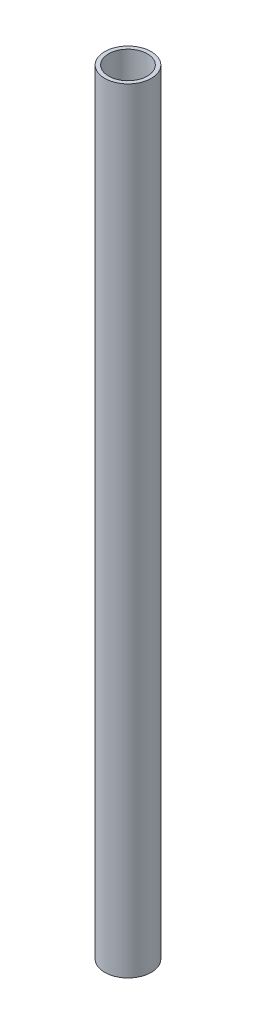
ISO-10303-21;
HEADER;
FILE_DESCRIPTION(('STEP AP214'),'2;1');
FILE_NAME('part.step','',(''),(''),'','','');
FILE_SCHEMA(('AUTOMOTIVE_DESIGN { 1 0 10303 214 1 1 1 1 }'));
ENDSEC;
DATA;
#1=APPLICATION_CONTEXT('core data for automotive mechanical design processes');
#2=APPLICATION_PROTOCOL_DEFINITION('international standard','automotive_design',2000,#1);
#3=PRODUCT_CONTEXT('',#1,'mechanical');
#4=PRODUCT('Part','Part','',(#3));
#5=PRODUCT_RELATED_PRODUCT_CATEGORY('part','',(#4));
#6=PRODUCT_DEFINITION_FORMATION('','',#4);
#7=PRODUCT_DEFINITION_CONTEXT('part definition',#1,'design');
#8=PRODUCT_DEFINITION('design','',#6,#7);
#9=PRODUCT_DEFINITION_SHAPE('','',#8);
#10=(LENGTH_UNIT() NAMED_UNIT(*) SI_UNIT(.MILLI.,.METRE.));
#11=(NAMED_UNIT(*) PLANE_ANGLE_UNIT() SI_UNIT($,.RADIAN.));
#12=(NAMED_UNIT(*) SI_UNIT($,.STERADIAN.) SOLID_ANGLE_UNIT());
#13=UNCERTAINTY_MEASURE_WITH_UNIT(LENGTH_MEASURE(1.E-05),#10,'distance_accuracy_value','');
#14=(GEOMETRIC_REPRESENTATION_CONTEXT(3) GLOBAL_UNCERTAINTY_ASSIGNED_CONTEXT((#13)) GLOBAL_UNIT_ASSIGNED_CONTEXT((#10,
#11,#12)) REPRESENTATION_CONTEXT('',''));
#15=CARTESIAN_POINT('',(0.,0.,0.));
#16=DIRECTION('',(0.,0.,1.));
#17=DIRECTION('',(1.,0.,0.));
#18=AXIS2_PLACEMENT_3D('',#15,#16,#17);
#19=CARTESIAN_POINT('',(0.,200.,0.));
#20=DIRECTION('',(0.,1.,0.));
#21=DIRECTION('',(0.,0.,1.));
#22=AXIS2_PLACEMENT_3D('',#19,#20,#21);
#23=PLANE('',#22);
#24=CARTESIAN_POINT('',(0.,200.,0.));
#25=DIRECTION('',(0.,1.,0.));
#26=DIRECTION('',(0.,0.,1.));
#27=AXIS2_PLACEMENT_3D('',#24,#25,#26);
#28=CIRCLE('',#27,6.);
#29=CARTESIAN_POINT('',(0.,200.,6.));
#30=VERTEX_POINT('',#29);
#31=EDGE_CURVE('E10',#30,#30,#28,.T.);
#32=ORIENTED_EDGE('',*,*,#31,.T.);
#33=EDGE_LOOP('',(#32));
#34=FACE_BOUND('',#33,.T.);
#35=CARTESIAN_POINT('',(0.,200.,0.));
#36=DIRECTION('',(0.,1.,0.));
#37=DIRECTION('',(0.,0.,1.));
#38=AXIS2_PLACEMENT_3D('',#35,#36,#37);
#39=CIRCLE('',#38,5.);
#40=CARTESIAN_POINT('',(0.,200.,5.));
#41=VERTEX_POINT('',#40);
#42=EDGE_CURVE('E50',#41,#41,#39,.T.);
#43=ORIENTED_EDGE('',*,*,#42,.F.);
#44=EDGE_LOOP('',(#43));
#45=FACE_BOUND('',#44,.T.);
#46=ADVANCED_FACE('F37',(#34,#45),#23,.T.);
#47=CARTESIAN_POINT('',(0.,0.,0.));
#48=DIRECTION('',(0.,1.,0.));
#49=DIRECTION('',(0.,0.,1.));
#50=AXIS2_PLACEMENT_3D('',#47,#48,#49);
#51=PLANE('',#50);
#52=CARTESIAN_POINT('',(0.,0.,0.));
#53=DIRECTION('',(0.,1.,0.));
#54=DIRECTION('',(0.,0.,1.));
#55=AXIS2_PLACEMENT_3D('',#52,#53,#54);
#56=CIRCLE('',#55,6.);
#57=CARTESIAN_POINT('',(0.,0.,6.));
#58=VERTEX_POINT('',#57);
#59=EDGE_CURVE('E41',#58,#58,#56,.T.);
#60=ORIENTED_EDGE('',*,*,#59,.F.);
#61=EDGE_LOOP('',(#60));
#62=FACE_BOUND('',#61,.T.);
#63=CARTESIAN_POINT('',(0.,0.,0.));
#64=DIRECTION('',(0.,1.,0.));
#65=DIRECTION('',(0.,0.,1.));
#66=AXIS2_PLACEMENT_3D('',#63,#64,#65);
#67=CIRCLE('',#66,5.);
#68=CARTESIAN_POINT('',(0.,0.,5.));
#69=VERTEX_POINT('',#68);
#70=EDGE_CURVE('E52',#69,#69,#67,.T.);
#71=ORIENTED_EDGE('',*,*,#70,.T.);
#72=EDGE_LOOP('',(#71));
#73=FACE_BOUND('',#72,.T.);
#74=ADVANCED_FACE('F64',(#62,#73),#51,.F.);
#75=CARTESIAN_POINT('',(0.,200.,0.));
#76=DIRECTION('',(0.,-1.,0.));
#77=DIRECTION('',(0.,0.,-1.));
#78=AXIS2_PLACEMENT_3D('',#75,#76,#77);
#79=CYLINDRICAL_SURFACE('',#78,6.);
#80=ORIENTED_EDGE('',*,*,#31,.F.);
#81=EDGE_LOOP('',(#80));
#82=FACE_BOUND('',#81,.T.);
#83=ORIENTED_EDGE('',*,*,#59,.T.);
#84=EDGE_LOOP('',(#83));
#85=FACE_BOUND('',#84,.T.);
#86=ADVANCED_FACE('F39',(#82,#85),#79,.T.);
#87=CARTESIAN_POINT('',(0.,200.,0.));
#88=DIRECTION('',(0.,-1.,0.));
#89=DIRECTION('',(0.,0.,-1.));
#90=AXIS2_PLACEMENT_3D('',#87,#88,#89);
#91=CYLINDRICAL_SURFACE('',#90,5.);
#92=ORIENTED_EDGE('',*,*,#42,.T.);
#93=EDGE_LOOP('',(#92));
#94=FACE_BOUND('',#93,.T.);
#95=ORIENTED_EDGE('',*,*,#70,.F.);
#96=EDGE_LOOP('',(#95));
#97=FACE_BOUND('',#96,.T.);
#98=ADVANCED_FACE('F60',(#94,#97),#91,.F.);
#99=CLOSED_SHELL('',(#46,#74,#86,#98));
#100=MANIFOLD_SOLID_BREP('B2',#99);
#101=ADVANCED_BREP_SHAPE_REPRESENTATION('',(#18,#100),#14);
#102=SHAPE_DEFINITION_REPRESENTATION(#9,#101);
ENDSEC;
END-ISO-10303-21;
